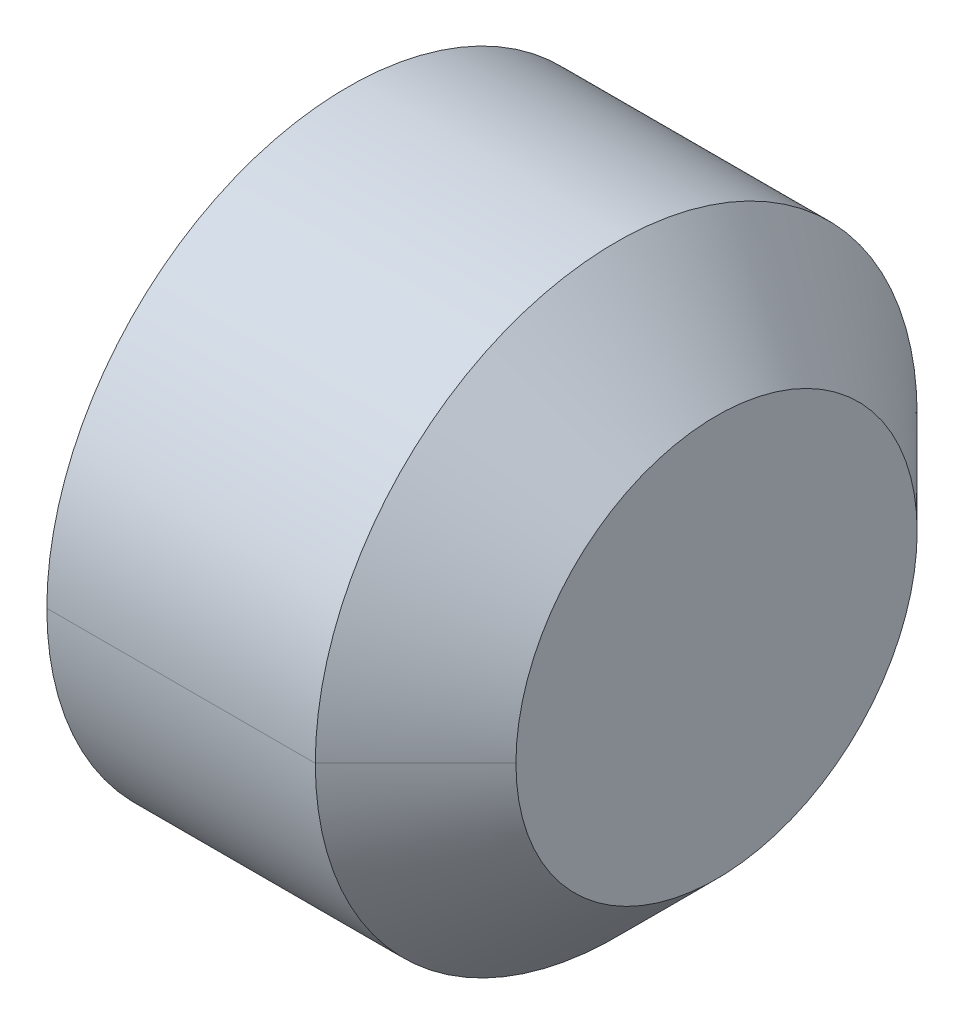
ISO-10303-21;
HEADER;
FILE_DESCRIPTION(('STEP AP214'),'2;1');
FILE_NAME('part.step','',(''),(''),'','','');
FILE_SCHEMA(('AUTOMOTIVE_DESIGN { 1 0 10303 214 1 1 1 1 }'));
ENDSEC;
DATA;
#1=APPLICATION_CONTEXT('core data for automotive mechanical design processes');
#2=APPLICATION_PROTOCOL_DEFINITION('international standard','automotive_design',2000,#1);
#3=PRODUCT_CONTEXT('',#1,'mechanical');
#4=PRODUCT('Part','Part','',(#3));
#5=PRODUCT_RELATED_PRODUCT_CATEGORY('part','',(#4));
#6=PRODUCT_DEFINITION_FORMATION('','',#4);
#7=PRODUCT_DEFINITION_CONTEXT('part definition',#1,'design');
#8=PRODUCT_DEFINITION('design','',#6,#7);
#9=PRODUCT_DEFINITION_SHAPE('','',#8);
#10=(LENGTH_UNIT() NAMED_UNIT(*) SI_UNIT(.MILLI.,.METRE.));
#11=(NAMED_UNIT(*) PLANE_ANGLE_UNIT() SI_UNIT($,.RADIAN.));
#12=(NAMED_UNIT(*) SI_UNIT($,.STERADIAN.) SOLID_ANGLE_UNIT());
#13=UNCERTAINTY_MEASURE_WITH_UNIT(LENGTH_MEASURE(1.E-05),#10,'distance_accuracy_value','');
#14=(GEOMETRIC_REPRESENTATION_CONTEXT(3) GLOBAL_UNCERTAINTY_ASSIGNED_CONTEXT((#13)) GLOBAL_UNIT_ASSIGNED_CONTEXT((#10,
#11,#12)) REPRESENTATION_CONTEXT('',''));
#15=CARTESIAN_POINT('',(0.,0.,0.));
#16=DIRECTION('',(0.,0.,1.));
#17=DIRECTION('',(1.,0.,0.));
#18=AXIS2_PLACEMENT_3D('',#15,#16,#17);
#19=CARTESIAN_POINT('',(1.2,1.5,0.));
#20=DIRECTION('',(1.,0.,0.));
#21=DIRECTION('',(0.,1.,0.));
#22=AXIS2_PLACEMENT_3D('',#19,#20,#21);
#23=PLANE('',#22);
#24=DIRECTION('',(0.,-0.866025403784438,0.5));
#25=VECTOR('',#24,1.);
#26=CARTESIAN_POINT('',(1.2,0.75,0.433012701892217));
#27=LINE('',#26,#25);
#28=CARTESIAN_POINT('',(1.2,0.75,0.433012701892217));
#29=VERTEX_POINT('',#28);
#30=CARTESIAN_POINT('',(1.2,0.,0.866025403784437));
#31=VERTEX_POINT('',#30);
#32=EDGE_CURVE('E207',#29,#31,#27,.T.);
#33=ORIENTED_EDGE('',*,*,#32,.F.);
#34=DIRECTION('',(0.,0.,-1.));
#35=VECTOR('',#34,1.);
#36=CARTESIAN_POINT('',(1.2,0.75,0.433012701892217));
#37=LINE('',#36,#35);
#38=CARTESIAN_POINT('',(1.2,0.75,-0.433012701892222));
#39=VERTEX_POINT('',#38);
#40=EDGE_CURVE('E10',#29,#39,#37,.T.);
#41=ORIENTED_EDGE('',*,*,#40,.T.);
#42=DIRECTION('',(0.,-0.866025403784439,-0.5));
#43=VECTOR('',#42,1.);
#44=CARTESIAN_POINT('',(1.2,0.75,-0.433012701892222));
#45=LINE('',#44,#43);
#46=CARTESIAN_POINT('',(1.2,0.,-0.866025403784441));
#47=VERTEX_POINT('',#46);
#48=EDGE_CURVE('E45',#39,#47,#45,.T.);
#49=ORIENTED_EDGE('',*,*,#48,.T.);
#50=DIRECTION('',(0.,0.866025403784438,-0.5));
#51=VECTOR('',#50,1.);
#52=CARTESIAN_POINT('',(1.2,-0.75,-0.433012701892221));
#53=LINE('',#52,#51);
#54=CARTESIAN_POINT('',(1.2,-0.75,-0.433012701892221));
#55=VERTEX_POINT('',#54);
#56=EDGE_CURVE('E227',#55,#47,#53,.T.);
#57=ORIENTED_EDGE('',*,*,#56,.F.);
#58=DIRECTION('',(0.,0.,-1.));
#59=VECTOR('',#58,1.);
#60=CARTESIAN_POINT('',(1.2,-0.75,0.433012701892218));
#61=LINE('',#60,#59);
#62=CARTESIAN_POINT('',(1.2,-0.75,0.433012701892218));
#63=VERTEX_POINT('',#62);
#64=EDGE_CURVE('E220',#63,#55,#61,.T.);
#65=ORIENTED_EDGE('',*,*,#64,.F.);
#66=DIRECTION('',(0.,0.866025403784439,0.5));
#67=VECTOR('',#66,1.);
#68=CARTESIAN_POINT('',(1.2,-0.75,0.433012701892218));
#69=LINE('',#68,#67);
#70=EDGE_CURVE('E214',#63,#31,#69,.T.);
#71=ORIENTED_EDGE('',*,*,#70,.T.);
#72=EDGE_LOOP('',(#33,#41,#49,#57,#65,#71));
#73=FACE_BOUND('',#72,.T.);
#74=ADVANCED_FACE('F16',(#73),#23,.F.);
#75=CARTESIAN_POINT('',(1.2,0.75,0.433012701892217));
#76=DIRECTION('',(0.,1.,0.));
#77=DIRECTION('',(0.,0.,-1.));
#78=AXIS2_PLACEMENT_3D('',#75,#76,#77);
#79=PLANE('',#78);
#80=DIRECTION('',(0.,0.,-1.));
#81=VECTOR('',#80,1.);
#82=CARTESIAN_POINT('',(0.,0.75,0.433012701892217));
#83=LINE('',#82,#81);
#84=CARTESIAN_POINT('',(0.,0.75,0.433012701892217));
#85=VERTEX_POINT('',#84);
#86=CARTESIAN_POINT('',(0.,0.75,-0.433012701892222));
#87=VERTEX_POINT('',#86);
#88=EDGE_CURVE('E129',#85,#87,#83,.T.);
#89=ORIENTED_EDGE('',*,*,#88,.T.);
#90=DIRECTION('',(-1.,0.,0.));
#91=VECTOR('',#90,1.);
#92=CARTESIAN_POINT('',(1.2,0.75,-0.433012701892222));
#93=LINE('',#92,#91);
#94=EDGE_CURVE('E20',#39,#87,#93,.T.);
#95=ORIENTED_EDGE('',*,*,#94,.F.);
#96=ORIENTED_EDGE('',*,*,#40,.F.);
#97=DIRECTION('',(-1.,0.,0.));
#98=VECTOR('',#97,1.);
#99=CARTESIAN_POINT('',(1.2,0.75,0.433012701892217));
#100=LINE('',#99,#98);
#101=EDGE_CURVE('E204',#29,#85,#100,.T.);
#102=ORIENTED_EDGE('',*,*,#101,.T.);
#103=EDGE_LOOP('',(#89,#95,#96,#102));
#104=FACE_BOUND('',#103,.T.);
#105=ADVANCED_FACE('F18',(#104),#79,.F.);
#106=CARTESIAN_POINT('',(1.2,0.75,-0.433012701892222));
#107=DIRECTION('',(0.,0.5,-0.866025403784439));
#108=DIRECTION('',(-1.,0.,0.));
#109=AXIS2_PLACEMENT_3D('',#106,#107,#108);
#110=PLANE('',#109);
#111=DIRECTION('',(0.,-0.866025403784439,-0.5));
#112=VECTOR('',#111,1.);
#113=CARTESIAN_POINT('',(0.,0.75,-0.433012701892222));
#114=LINE('',#113,#112);
#115=CARTESIAN_POINT('',(0.,0.,-0.866025403784441));
#116=VERTEX_POINT('',#115);
#117=EDGE_CURVE('E192',#87,#116,#114,.T.);
#118=ORIENTED_EDGE('',*,*,#117,.T.);
#119=DIRECTION('',(-1.,0.,0.));
#120=VECTOR('',#119,1.);
#121=CARTESIAN_POINT('',(1.2,0.,-0.866025403784441));
#122=LINE('',#121,#120);
#123=EDGE_CURVE('E231',#47,#116,#122,.T.);
#124=ORIENTED_EDGE('',*,*,#123,.F.);
#125=ORIENTED_EDGE('',*,*,#48,.F.);
#126=ORIENTED_EDGE('',*,*,#94,.T.);
#127=EDGE_LOOP('',(#118,#124,#125,#126));
#128=FACE_BOUND('',#127,.T.);
#129=ADVANCED_FACE('F242',(#128),#110,.F.);
#130=CARTESIAN_POINT('',(1.2,-0.75,-0.433012701892221));
#131=DIRECTION('',(0.,0.5,0.866025403784438));
#132=DIRECTION('',(1.,0.,0.));
#133=AXIS2_PLACEMENT_3D('',#130,#131,#132);
#134=PLANE('',#133);
#135=DIRECTION('',(0.,0.866025403784438,-0.5));
#136=VECTOR('',#135,1.);
#137=CARTESIAN_POINT('',(0.,-0.75,-0.433012701892221));
#138=LINE('',#137,#136);
#139=CARTESIAN_POINT('',(0.,-0.75,-0.433012701892221));
#140=VERTEX_POINT('',#139);
#141=EDGE_CURVE('E188',#140,#116,#138,.T.);
#142=ORIENTED_EDGE('',*,*,#141,.F.);
#143=DIRECTION('',(-1.,0.,0.));
#144=VECTOR('',#143,1.);
#145=CARTESIAN_POINT('',(1.2,-0.75,-0.433012701892221));
#146=LINE('',#145,#144);
#147=EDGE_CURVE('E224',#55,#140,#146,.T.);
#148=ORIENTED_EDGE('',*,*,#147,.F.);
#149=ORIENTED_EDGE('',*,*,#56,.T.);
#150=ORIENTED_EDGE('',*,*,#123,.T.);
#151=EDGE_LOOP('',(#142,#148,#149,#150));
#152=FACE_BOUND('',#151,.T.);
#153=ADVANCED_FACE('F388',(#152),#134,.T.);
#154=CARTESIAN_POINT('',(1.2,-0.75,0.433012701892218));
#155=DIRECTION('',(0.,1.,0.));
#156=DIRECTION('',(1.,0.,0.));
#157=AXIS2_PLACEMENT_3D('',#154,#155,#156);
#158=PLANE('',#157);
#159=DIRECTION('',(0.,0.,-1.));
#160=VECTOR('',#159,1.);
#161=CARTESIAN_POINT('',(0.,-0.75,0.433012701892218));
#162=LINE('',#161,#160);
#163=CARTESIAN_POINT('',(0.,-0.75,0.433012701892218));
#164=VERTEX_POINT('',#163);
#165=EDGE_CURVE('E184',#164,#140,#162,.T.);
#166=ORIENTED_EDGE('',*,*,#165,.F.);
#167=DIRECTION('',(-1.,0.,0.));
#168=VECTOR('',#167,1.);
#169=CARTESIAN_POINT('',(1.2,-0.75,0.433012701892218));
#170=LINE('',#169,#168);
#171=EDGE_CURVE('E217',#63,#164,#170,.T.);
#172=ORIENTED_EDGE('',*,*,#171,.F.);
#173=ORIENTED_EDGE('',*,*,#64,.T.);
#174=ORIENTED_EDGE('',*,*,#147,.T.);
#175=EDGE_LOOP('',(#166,#172,#173,#174));
#176=FACE_BOUND('',#175,.T.);
#177=ADVANCED_FACE('F392',(#176),#158,.T.);
#178=CARTESIAN_POINT('',(1.2,-0.75,0.433012701892218));
#179=DIRECTION('',(0.,-0.5,0.866025403784439));
#180=DIRECTION('',(-1.,0.,0.));
#181=AXIS2_PLACEMENT_3D('',#178,#179,#180);
#182=PLANE('',#181);
#183=DIRECTION('',(0.,0.866025403784439,0.5));
#184=VECTOR('',#183,1.);
#185=CARTESIAN_POINT('',(0.,-0.75,0.433012701892218));
#186=LINE('',#185,#184);
#187=CARTESIAN_POINT('',(0.,0.,0.866025403784437));
#188=VERTEX_POINT('',#187);
#189=EDGE_CURVE('E180',#164,#188,#186,.T.);
#190=ORIENTED_EDGE('',*,*,#189,.T.);
#191=DIRECTION('',(-1.,0.,0.));
#192=VECTOR('',#191,1.);
#193=CARTESIAN_POINT('',(1.2,0.,0.866025403784437));
#194=LINE('',#193,#192);
#195=EDGE_CURVE('E211',#31,#188,#194,.T.);
#196=ORIENTED_EDGE('',*,*,#195,.F.);
#197=ORIENTED_EDGE('',*,*,#70,.F.);
#198=ORIENTED_EDGE('',*,*,#171,.T.);
#199=EDGE_LOOP('',(#190,#196,#197,#198));
#200=FACE_BOUND('',#199,.T.);
#201=ADVANCED_FACE('F439',(#200),#182,.F.);
#202=CARTESIAN_POINT('',(1.2,0.75,0.433012701892217));
#203=DIRECTION('',(0.,-0.5,-0.866025403784438));
#204=DIRECTION('',(0.,-0.866025403784438,0.5));
#205=AXIS2_PLACEMENT_3D('',#202,#203,#204);
#206=PLANE('',#205);
#207=DIRECTION('',(0.,-0.866025403784438,0.5));
#208=VECTOR('',#207,1.);
#209=CARTESIAN_POINT('',(0.,0.75,0.433012701892217));
#210=LINE('',#209,#208);
#211=EDGE_CURVE('E162',#85,#188,#210,.T.);
#212=ORIENTED_EDGE('',*,*,#211,.F.);
#213=ORIENTED_EDGE('',*,*,#101,.F.);
#214=ORIENTED_EDGE('',*,*,#32,.T.);
#215=ORIENTED_EDGE('',*,*,#195,.T.);
#216=EDGE_LOOP('',(#212,#213,#214,#215));
#217=FACE_BOUND('',#216,.T.);
#218=ADVANCED_FACE('F250',(#217),#206,.T.);
#219=CARTESIAN_POINT('',(0.,0.,0.));
#220=DIRECTION('',(1.,0.,0.));
#221=DIRECTION('',(0.,0.,-1.));
#222=AXIS2_PLACEMENT_3D('',#219,#220,#221);
#223=CONICAL_SURFACE('',#222,1.2195,1.0471975511966);
#224=DIRECTION('',(0.5,0.,0.86602540378444));
#225=VECTOR('',#224,1.);
#226=CARTESIAN_POINT('',(0.,0.,1.2195));
#227=LINE('',#226,#225);
#228=CARTESIAN_POINT('',(0.,0.,1.2195));
#229=VERTEX_POINT('',#228);
#230=CARTESIAN_POINT('',(0.161946750507689,0.,1.5));
#231=VERTEX_POINT('',#230);
#232=EDGE_CURVE('E133',#229,#231,#227,.T.);
#233=ORIENTED_EDGE('',*,*,#232,.F.);
#234=CARTESIAN_POINT('',(0.,0.,0.));
#235=DIRECTION('',(-1.,0.,0.));
#236=DIRECTION('',(0.,0.,1.));
#237=AXIS2_PLACEMENT_3D('',#234,#235,#236);
#238=CIRCLE('',#237,1.2195);
#239=CARTESIAN_POINT('',(0.,0.,-1.2195));
#240=VERTEX_POINT('',#239);
#241=EDGE_CURVE('E120',#240,#229,#238,.T.);
#242=ORIENTED_EDGE('',*,*,#241,.F.);
#243=DIRECTION('',(0.5,0.,-0.86602540378444));
#244=VECTOR('',#243,1.);
#245=CARTESIAN_POINT('',(0.,0.,-1.2195));
#246=LINE('',#245,#244);
#247=CARTESIAN_POINT('',(0.161946750507689,0.,-1.5));
#248=VERTEX_POINT('',#247);
#249=EDGE_CURVE('E143',#240,#248,#246,.T.);
#250=ORIENTED_EDGE('',*,*,#249,.T.);
#251=CARTESIAN_POINT('',(0.161946750507689,0.,0.));
#252=DIRECTION('',(-1.,0.,0.));
#253=DIRECTION('',(0.,0.,1.));
#254=AXIS2_PLACEMENT_3D('',#251,#252,#253);
#255=CIRCLE('',#254,1.5);
#256=EDGE_CURVE('E135',#248,#231,#255,.T.);
#257=ORIENTED_EDGE('',*,*,#256,.T.);
#258=EDGE_LOOP('',(#233,#242,#250,#257));
#259=FACE_BOUND('',#258,.T.);
#260=ADVANCED_FACE('F134',(#259),#223,.T.);
#261=CARTESIAN_POINT('',(-12.7,0.,0.));
#262=DIRECTION('',(-1.,0.,0.));
#263=DIRECTION('',(0.,0.,1.));
#264=AXIS2_PLACEMENT_3D('',#261,#262,#263);
#265=CYLINDRICAL_SURFACE('',#264,1.5);
#266=DIRECTION('',(-1.,0.,0.));
#267=VECTOR('',#266,1.);
#268=CARTESIAN_POINT('',(-12.7,0.,-1.5));
#269=LINE('',#268,#267);
#270=CARTESIAN_POINT('',(1.5,0.,-1.5));
#271=VERTEX_POINT('',#270);
#272=EDGE_CURVE('E158',#271,#248,#269,.T.);
#273=ORIENTED_EDGE('',*,*,#272,.F.);
#274=CARTESIAN_POINT('',(1.5,0.,0.));
#275=DIRECTION('',(-1.,0.,0.));
#276=DIRECTION('',(0.,0.,1.));
#277=AXIS2_PLACEMENT_3D('',#274,#275,#276);
#278=CIRCLE('',#277,1.5);
#279=CARTESIAN_POINT('',(1.5,0.,1.5));
#280=VERTEX_POINT('',#279);
#281=EDGE_CURVE('E199',#271,#280,#278,.T.);
#282=ORIENTED_EDGE('',*,*,#281,.T.);
#283=DIRECTION('',(-1.,0.,0.));
#284=VECTOR('',#283,1.);
#285=CARTESIAN_POINT('',(-12.7,0.,1.5));
#286=LINE('',#285,#284);
#287=EDGE_CURVE('E166',#280,#231,#286,.T.);
#288=ORIENTED_EDGE('',*,*,#287,.T.);
#289=ORIENTED_EDGE('',*,*,#256,.F.);
#290=EDGE_LOOP('',(#273,#282,#288,#289));
#291=FACE_BOUND('',#290,.T.);
#292=ADVANCED_FACE('F401',(#291),#265,.T.);
#293=CARTESIAN_POINT('',(1.5,0.,0.));
#294=DIRECTION('',(-1.,0.,0.));
#295=DIRECTION('',(0.,0.,1.));
#296=AXIS2_PLACEMENT_3D('',#293,#294,#295);
#297=CONICAL_SURFACE('',#296,1.5,0.785398163397452);
#298=DIRECTION('',(-0.707106781186545,0.,-0.70710678118655));
#299=VECTOR('',#298,1.);
#300=CARTESIAN_POINT('',(1.5,0.,-1.5));
#301=LINE('',#300,#299);
#302=CARTESIAN_POINT('',(2.,0.,-1.));
#303=VERTEX_POINT('',#302);
#304=EDGE_CURVE('E170',#303,#271,#301,.T.);
#305=ORIENTED_EDGE('',*,*,#304,.F.);
#306=CARTESIAN_POINT('',(2.,0.,0.));
#307=DIRECTION('',(-1.,0.,0.));
#308=DIRECTION('',(0.,0.,1.));
#309=AXIS2_PLACEMENT_3D('',#306,#307,#308);
#310=CIRCLE('',#309,1.);
#311=CARTESIAN_POINT('',(2.,0.,1.));
#312=VERTEX_POINT('',#311);
#313=EDGE_CURVE('E196',#303,#312,#310,.T.);
#314=ORIENTED_EDGE('',*,*,#313,.T.);
#315=DIRECTION('',(-0.707106781186545,0.,0.70710678118655));
#316=VECTOR('',#315,1.);
#317=CARTESIAN_POINT('',(1.5,0.,1.5));
#318=LINE('',#317,#316);
#319=EDGE_CURVE('E130',#312,#280,#318,.T.);
#320=ORIENTED_EDGE('',*,*,#319,.T.);
#321=ORIENTED_EDGE('',*,*,#281,.F.);
#322=EDGE_LOOP('',(#305,#314,#320,#321));
#323=FACE_BOUND('',#322,.T.);
#324=ADVANCED_FACE('F365',(#323),#297,.T.);
#325=CARTESIAN_POINT('',(2.,1.,0.));
#326=DIRECTION('',(1.,0.,0.));
#327=DIRECTION('',(0.,1.,0.));
#328=AXIS2_PLACEMENT_3D('',#325,#326,#327);
#329=PLANE('',#328);
#330=CARTESIAN_POINT('',(2.,0.,0.));
#331=DIRECTION('',(-1.,0.,0.));
#332=DIRECTION('',(0.,0.,1.));
#333=AXIS2_PLACEMENT_3D('',#330,#331,#332);
#334=CIRCLE('',#333,1.);
#335=EDGE_CURVE('E167',#312,#303,#334,.T.);
#336=ORIENTED_EDGE('',*,*,#335,.F.);
#337=ORIENTED_EDGE('',*,*,#313,.F.);
#338=EDGE_LOOP('',(#336,#337));
#339=FACE_BOUND('',#338,.T.);
#340=ADVANCED_FACE('F361',(#339),#329,.T.);
#341=CARTESIAN_POINT('',(0.,0.,0.));
#342=DIRECTION('',(-1.,0.,0.));
#343=DIRECTION('',(0.,0.,1.));
#344=AXIS2_PLACEMENT_3D('',#341,#342,#343);
#345=PLANE('',#344);
#346=ORIENTED_EDGE('',*,*,#88,.F.);
#347=ORIENTED_EDGE('',*,*,#211,.T.);
#348=ORIENTED_EDGE('',*,*,#189,.F.);
#349=ORIENTED_EDGE('',*,*,#165,.T.);
#350=ORIENTED_EDGE('',*,*,#141,.T.);
#351=ORIENTED_EDGE('',*,*,#117,.F.);
#352=EDGE_LOOP('',(#346,#347,#348,#349,#350,#351));
#353=FACE_BOUND('',#352,.T.);
#354=ORIENTED_EDGE('',*,*,#241,.T.);
#355=CARTESIAN_POINT('',(0.,0.,0.));
#356=DIRECTION('',(-1.,0.,0.));
#357=DIRECTION('',(0.,0.,1.));
#358=AXIS2_PLACEMENT_3D('',#355,#356,#357);
#359=CIRCLE('',#358,1.2195);
#360=EDGE_CURVE('E124',#229,#240,#359,.T.);
#361=ORIENTED_EDGE('',*,*,#360,.T.);
#362=EDGE_LOOP('',(#354,#361));
#363=FACE_BOUND('',#362,.T.);
#364=ADVANCED_FACE('F122',(#353,#363),#345,.T.);
#365=CARTESIAN_POINT('',(1.5,0.,0.));
#366=DIRECTION('',(-1.,0.,0.));
#367=DIRECTION('',(0.,0.,1.));
#368=AXIS2_PLACEMENT_3D('',#365,#366,#367);
#369=CONICAL_SURFACE('',#368,1.5,0.785398163397452);
#370=ORIENTED_EDGE('',*,*,#335,.T.);
#371=ORIENTED_EDGE('',*,*,#304,.T.);
#372=CARTESIAN_POINT('',(1.5,0.,0.));
#373=DIRECTION('',(-1.,0.,0.));
#374=DIRECTION('',(0.,0.,1.));
#375=AXIS2_PLACEMENT_3D('',#372,#373,#374);
#376=CIRCLE('',#375,1.5);
#377=EDGE_CURVE('E154',#280,#271,#376,.T.);
#378=ORIENTED_EDGE('',*,*,#377,.F.);
#379=ORIENTED_EDGE('',*,*,#319,.F.);
#380=EDGE_LOOP('',(#370,#371,#378,#379));
#381=FACE_BOUND('',#380,.T.);
#382=ADVANCED_FACE('F374',(#381),#369,.T.);
#383=CARTESIAN_POINT('',(-12.7,0.,0.));
#384=DIRECTION('',(-1.,0.,0.));
#385=DIRECTION('',(0.,0.,1.));
#386=AXIS2_PLACEMENT_3D('',#383,#384,#385);
#387=CYLINDRICAL_SURFACE('',#386,1.5);
#388=ORIENTED_EDGE('',*,*,#377,.T.);
#389=ORIENTED_EDGE('',*,*,#272,.T.);
#390=CARTESIAN_POINT('',(0.161946750507689,0.,0.));
#391=DIRECTION('',(-1.,0.,0.));
#392=DIRECTION('',(0.,0.,1.));
#393=AXIS2_PLACEMENT_3D('',#390,#391,#392);
#394=CIRCLE('',#393,1.5);
#395=EDGE_CURVE('E140',#231,#248,#394,.T.);
#396=ORIENTED_EDGE('',*,*,#395,.F.);
#397=ORIENTED_EDGE('',*,*,#287,.F.);
#398=EDGE_LOOP('',(#388,#389,#396,#397));
#399=FACE_BOUND('',#398,.T.);
#400=ADVANCED_FACE('F356',(#399),#387,.T.);
#401=CARTESIAN_POINT('',(0.,0.,0.));
#402=DIRECTION('',(1.,0.,0.));
#403=DIRECTION('',(0.,0.,-1.));
#404=AXIS2_PLACEMENT_3D('',#401,#402,#403);
#405=CONICAL_SURFACE('',#404,1.2195,1.0471975511966);
#406=ORIENTED_EDGE('',*,*,#360,.F.);
#407=ORIENTED_EDGE('',*,*,#232,.T.);
#408=ORIENTED_EDGE('',*,*,#395,.T.);
#409=ORIENTED_EDGE('',*,*,#249,.F.);
#410=EDGE_LOOP('',(#406,#407,#408,#409));
#411=FACE_BOUND('',#410,.T.);
#412=ADVANCED_FACE('F142',(#411),#405,.T.);
#413=CLOSED_SHELL('',(#74,#105,#129,#153,#177,#201,#218,#260,#292,#324,#340,#364,#382,#400,#412));
#414=MANIFOLD_SOLID_BREP('B1',#413);
#415=ADVANCED_BREP_SHAPE_REPRESENTATION('',(#18,#414),#14);
#416=SHAPE_DEFINITION_REPRESENTATION(#9,#415);
ENDSEC;
END-ISO-10303-21;
